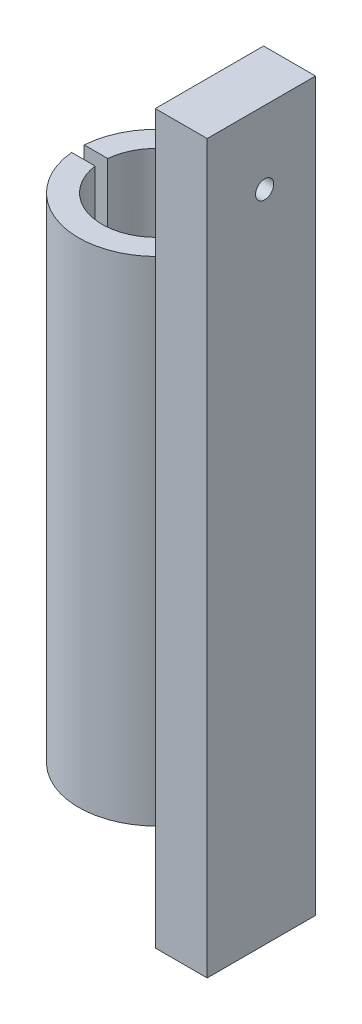
ISO-10303-21;
HEADER;
FILE_DESCRIPTION(('STEP AP214'),'2;1');
FILE_NAME('part.step','',(''),(''),'','','');
FILE_SCHEMA(('AUTOMOTIVE_DESIGN { 1 0 10303 214 1 1 1 1 }'));
ENDSEC;
DATA;
#1=APPLICATION_CONTEXT('core data for automotive mechanical design processes');
#2=APPLICATION_PROTOCOL_DEFINITION('international standard','automotive_design',2000,#1);
#3=PRODUCT_CONTEXT('',#1,'mechanical');
#4=PRODUCT('Part','Part','',(#3));
#5=PRODUCT_RELATED_PRODUCT_CATEGORY('part','',(#4));
#6=PRODUCT_DEFINITION_FORMATION('','',#4);
#7=PRODUCT_DEFINITION_CONTEXT('part definition',#1,'design');
#8=PRODUCT_DEFINITION('design','',#6,#7);
#9=PRODUCT_DEFINITION_SHAPE('','',#8);
#10=(LENGTH_UNIT() NAMED_UNIT(*) SI_UNIT(.MILLI.,.METRE.));
#11=(NAMED_UNIT(*) PLANE_ANGLE_UNIT() SI_UNIT($,.RADIAN.));
#12=(NAMED_UNIT(*) SI_UNIT($,.STERADIAN.) SOLID_ANGLE_UNIT());
#13=UNCERTAINTY_MEASURE_WITH_UNIT(LENGTH_MEASURE(1.E-05),#10,'distance_accuracy_value','');
#14=(GEOMETRIC_REPRESENTATION_CONTEXT(3) GLOBAL_UNCERTAINTY_ASSIGNED_CONTEXT((#13)) GLOBAL_UNIT_ASSIGNED_CONTEXT((#10,
#11,#12)) REPRESENTATION_CONTEXT('',''));
#15=CARTESIAN_POINT('',(0.,0.,0.));
#16=DIRECTION('',(0.,0.,1.));
#17=DIRECTION('',(1.,0.,0.));
#18=AXIS2_PLACEMENT_3D('',#15,#16,#17);
#19=CARTESIAN_POINT('',(0.,95.,0.));
#20=DIRECTION('',(0.,-1.,0.));
#21=DIRECTION('',(0.,0.,-1.));
#22=AXIS2_PLACEMENT_3D('',#19,#20,#21);
#23=CYLINDRICAL_SURFACE('',#22,15.);
#24=CARTESIAN_POINT('',(0.,0.,0.));
#25=DIRECTION('',(0.,1.,0.));
#26=DIRECTION('',(0.,0.,1.));
#27=AXIS2_PLACEMENT_3D('',#24,#25,#26);
#28=CIRCLE('',#27,15.);
#29=CARTESIAN_POINT('',(11.3568734785766,0.,-9.79905223945678));
#30=VERTEX_POINT('',#29);
#31=CARTESIAN_POINT('',(-14.9642919549713,0.,-1.03439174705795));
#32=VERTEX_POINT('',#31);
#33=EDGE_CURVE('E207',#30,#32,#28,.T.);
#34=ORIENTED_EDGE('',*,*,#33,.T.);
#35=DIRECTION('',(0.,-1.,0.));
#36=VECTOR('',#35,1.);
#37=CARTESIAN_POINT('',(-14.9642919549713,95.,-1.03439174705795));
#38=LINE('',#37,#36);
#39=CARTESIAN_POINT('',(-14.9642919549713,35.,-1.03439174705795));
#40=VERTEX_POINT('',#39);
#41=EDGE_CURVE('E393',#32,#40,#38,.F.);
#42=ORIENTED_EDGE('',*,*,#41,.T.);
#43=CARTESIAN_POINT('',(0.,35.,0.));
#44=DIRECTION('',(0.,-1.,0.));
#45=DIRECTION('',(0.,0.,-1.));
#46=AXIS2_PLACEMENT_3D('',#43,#44,#45);
#47=CIRCLE('',#46,15.);
#48=CARTESIAN_POINT('',(0.,35.,-15.));
#49=VERTEX_POINT('',#48);
#50=EDGE_CURVE('E264',#40,#49,#47,.T.);
#51=ORIENTED_EDGE('',*,*,#50,.T.);
#52=DIRECTION('',(0.,1.,0.));
#53=VECTOR('',#52,1.);
#54=CARTESIAN_POINT('',(0.,35.,-15.));
#55=LINE('',#54,#53);
#56=CARTESIAN_POINT('',(0.,75.,-15.));
#57=VERTEX_POINT('',#56);
#58=EDGE_CURVE('E418',#49,#57,#55,.T.);
#59=ORIENTED_EDGE('',*,*,#58,.T.);
#60=CARTESIAN_POINT('',(0.,75.,0.));
#61=DIRECTION('',(0.,1.,0.));
#62=DIRECTION('',(0.,0.,1.));
#63=AXIS2_PLACEMENT_3D('',#60,#61,#62);
#64=CIRCLE('',#63,15.);
#65=CARTESIAN_POINT('',(-14.9642919549713,75.,-1.03439174705795));
#66=VERTEX_POINT('',#65);
#67=EDGE_CURVE('E268',#57,#66,#64,.T.);
#68=ORIENTED_EDGE('',*,*,#67,.T.);
#69=CARTESIAN_POINT('',(-14.9642919549713,95.,-1.03439174705795));
#70=VERTEX_POINT('',#69);
#71=EDGE_CURVE('E57',#66,#70,#38,.F.);
#72=ORIENTED_EDGE('',*,*,#71,.T.);
#73=CARTESIAN_POINT('',(0.,95.,0.));
#74=DIRECTION('',(0.,1.,0.));
#75=DIRECTION('',(0.,0.,1.));
#76=AXIS2_PLACEMENT_3D('',#73,#74,#75);
#77=CIRCLE('',#76,15.);
#78=CARTESIAN_POINT('',(11.3568734785766,95.,-9.79905223945678));
#79=VERTEX_POINT('',#78);
#80=EDGE_CURVE('E206',#79,#70,#77,.T.);
#81=ORIENTED_EDGE('',*,*,#80,.F.);
#82=DIRECTION('',(0.,-1.,0.));
#83=VECTOR('',#82,1.);
#84=CARTESIAN_POINT('',(11.3568734785766,95.,-9.79905223945678));
#85=LINE('',#84,#83);
#86=EDGE_CURVE('E326',#79,#30,#85,.T.);
#87=ORIENTED_EDGE('',*,*,#86,.T.);
#88=EDGE_LOOP('',(#34,#42,#51,#59,#68,#72,#81,#87));
#89=FACE_BOUND('',#88,.T.);
#90=ADVANCED_FACE('F41',(#89),#23,.T.);
#91=CARTESIAN_POINT('',(-15.,75.,-15.));
#92=DIRECTION('',(0.,1.,0.));
#93=DIRECTION('',(0.,0.,1.));
#94=AXIS2_PLACEMENT_3D('',#91,#92,#93);
#95=PLANE('',#94);
#96=CARTESIAN_POINT('',(0.,75.,0.));
#97=DIRECTION('',(0.,1.,0.));
#98=DIRECTION('',(0.,0.,1.));
#99=AXIS2_PLACEMENT_3D('',#96,#97,#98);
#100=CIRCLE('',#99,10.5);
#101=CARTESIAN_POINT('',(-10.4489250027751,75.,-1.03439174705795));
#102=VERTEX_POINT('',#101);
#103=CARTESIAN_POINT('',(0.,75.,-10.5));
#104=VERTEX_POINT('',#103);
#105=EDGE_CURVE('E239',#102,#104,#100,.F.);
#106=ORIENTED_EDGE('',*,*,#105,.F.);
#107=DIRECTION('',(-1.,0.,0.));
#108=VECTOR('',#107,1.);
#109=CARTESIAN_POINT('',(-15.,75.,-1.03439174705795));
#110=LINE('',#109,#108);
#111=EDGE_CURVE('E398',#102,#66,#110,.T.);
#112=ORIENTED_EDGE('',*,*,#111,.T.);
#113=ORIENTED_EDGE('',*,*,#67,.F.);
#114=DIRECTION('',(0.,0.,1.));
#115=VECTOR('',#114,1.);
#116=CARTESIAN_POINT('',(0.,75.,-15.));
#117=LINE('',#116,#115);
#118=EDGE_CURVE('E270',#57,#104,#117,.T.);
#119=ORIENTED_EDGE('',*,*,#118,.T.);
#120=EDGE_LOOP('',(#106,#112,#113,#119));
#121=FACE_BOUND('',#120,.T.);
#122=ADVANCED_FACE('F454',(#121),#95,.F.);
#123=CARTESIAN_POINT('',(-15.,35.,-15.));
#124=DIRECTION('',(0.,-1.,0.));
#125=DIRECTION('',(0.,0.,-1.));
#126=AXIS2_PLACEMENT_3D('',#123,#124,#125);
#127=PLANE('',#126);
#128=ORIENTED_EDGE('',*,*,#50,.F.);
#129=DIRECTION('',(1.,0.,0.));
#130=VECTOR('',#129,1.);
#131=CARTESIAN_POINT('',(-15.,35.,-1.03439174705795));
#132=LINE('',#131,#130);
#133=CARTESIAN_POINT('',(-10.4489250027751,35.,-1.03439174705795));
#134=VERTEX_POINT('',#133);
#135=EDGE_CURVE('E11',#40,#134,#132,.T.);
#136=ORIENTED_EDGE('',*,*,#135,.T.);
#137=CARTESIAN_POINT('',(0.,35.,0.));
#138=DIRECTION('',(0.,-1.,0.));
#139=DIRECTION('',(0.,0.,-1.));
#140=AXIS2_PLACEMENT_3D('',#137,#138,#139);
#141=CIRCLE('',#140,10.5);
#142=CARTESIAN_POINT('',(0.,35.,-10.5));
#143=VERTEX_POINT('',#142);
#144=EDGE_CURVE('E227',#143,#134,#141,.F.);
#145=ORIENTED_EDGE('',*,*,#144,.F.);
#146=DIRECTION('',(0.,0.,1.));
#147=VECTOR('',#146,1.);
#148=CARTESIAN_POINT('',(0.,35.,-15.));
#149=LINE('',#148,#147);
#150=EDGE_CURVE('E272',#49,#143,#149,.T.);
#151=ORIENTED_EDGE('',*,*,#150,.F.);
#152=EDGE_LOOP('',(#128,#136,#145,#151));
#153=FACE_BOUND('',#152,.T.);
#154=ADVANCED_FACE('F414',(#153),#127,.F.);
#155=CARTESIAN_POINT('',(-14.9312235125397,95.,1.43476981379639));
#156=VERTEX_POINT('',#155);
#157=CARTESIAN_POINT('',(10.8084393786436,95.,10.4008479557287));
#158=VERTEX_POINT('',#157);
#159=EDGE_CURVE('E194',#156,#158,#77,.T.);
#160=ORIENTED_EDGE('',*,*,#159,.F.);
#161=DIRECTION('',(0.,-1.,0.));
#162=VECTOR('',#161,1.);
#163=CARTESIAN_POINT('',(-14.9312235125397,95.,1.43476981379639));
#164=LINE('',#163,#162);
#165=CARTESIAN_POINT('',(-14.9312235125397,75.,1.43476981379639));
#166=VERTEX_POINT('',#165);
#167=EDGE_CURVE('E177',#156,#166,#164,.T.);
#168=ORIENTED_EDGE('',*,*,#167,.T.);
#169=CARTESIAN_POINT('',(-10.1304452596063,75.,11.0622818099215));
#170=VERTEX_POINT('',#169);
#171=EDGE_CURVE('E263',#166,#170,#64,.T.);
#172=ORIENTED_EDGE('',*,*,#171,.T.);
#173=DIRECTION('',(0.,-1.,0.));
#174=VECTOR('',#173,1.);
#175=CARTESIAN_POINT('',(-10.1304452596063,95.,11.0622818099215));
#176=LINE('',#175,#174);
#177=CARTESIAN_POINT('',(-10.1304452596063,35.,11.0622818099215));
#178=VERTEX_POINT('',#177);
#179=EDGE_CURVE('E244',#178,#170,#176,.F.);
#180=ORIENTED_EDGE('',*,*,#179,.F.);
#181=CARTESIAN_POINT('',(-14.9312235125397,35.,1.43476981379639));
#182=VERTEX_POINT('',#181);
#183=EDGE_CURVE('E255',#178,#182,#47,.T.);
#184=ORIENTED_EDGE('',*,*,#183,.T.);
#185=CARTESIAN_POINT('',(-14.9312235125397,0.,1.43476981379639));
#186=VERTEX_POINT('',#185);
#187=EDGE_CURVE('E188',#182,#186,#164,.T.);
#188=ORIENTED_EDGE('',*,*,#187,.T.);
#189=CARTESIAN_POINT('',(10.8084393786436,0.,10.4008479557287));
#190=VERTEX_POINT('',#189);
#191=EDGE_CURVE('E214',#186,#190,#28,.T.);
#192=ORIENTED_EDGE('',*,*,#191,.T.);
#193=DIRECTION('',(0.,-1.,0.));
#194=VECTOR('',#193,1.);
#195=CARTESIAN_POINT('',(10.8084393786436,95.,10.4008479557287));
#196=LINE('',#195,#194);
#197=EDGE_CURVE('E204',#190,#158,#196,.F.);
#198=ORIENTED_EDGE('',*,*,#197,.T.);
#199=EDGE_LOOP('',(#160,#168,#172,#180,#184,#188,#192,#198));
#200=FACE_BOUND('',#199,.T.);
#201=ADVANCED_FACE('F43',(#200),#23,.T.);
#202=CARTESIAN_POINT('',(0.,95.,0.));
#203=DIRECTION('',(0.,1.,0.));
#204=DIRECTION('',(0.,0.,1.));
#205=AXIS2_PLACEMENT_3D('',#202,#203,#204);
#206=PLANE('',#205);
#207=DIRECTION('',(-1.,0.,0.));
#208=VECTOR('',#207,1.);
#209=CARTESIAN_POINT('',(-17.9321448671644,95.,-1.03439174705795));
#210=LINE('',#209,#208);
#211=CARTESIAN_POINT('',(-10.4489250027751,95.,-1.03439174705795));
#212=VERTEX_POINT('',#211);
#213=EDGE_CURVE('E199',#212,#70,#210,.T.);
#214=ORIENTED_EDGE('',*,*,#213,.F.);
#215=CARTESIAN_POINT('',(0.,95.,0.));
#216=DIRECTION('',(0.,1.,0.));
#217=DIRECTION('',(0.,0.,1.));
#218=AXIS2_PLACEMENT_3D('',#215,#216,#217);
#219=CIRCLE('',#218,10.5);
#220=CARTESIAN_POINT('',(-10.4015112162329,95.,1.43476981379639));
#221=VERTEX_POINT('',#220);
#222=EDGE_CURVE('E197',#221,#212,#219,.T.);
#223=ORIENTED_EDGE('',*,*,#222,.F.);
#224=DIRECTION('',(1.,0.,0.));
#225=VECTOR('',#224,1.);
#226=CARTESIAN_POINT('',(-17.9321448671644,95.,1.43476981379639));
#227=LINE('',#226,#225);
#228=EDGE_CURVE('E180',#156,#221,#227,.T.);
#229=ORIENTED_EDGE('',*,*,#228,.F.);
#230=ORIENTED_EDGE('',*,*,#159,.T.);
#231=DIRECTION('',(0.,0.,1.));
#232=VECTOR('',#231,1.);
#233=CARTESIAN_POINT('',(10.8084393786436,95.,0.));
#234=LINE('',#233,#232);
#235=CARTESIAN_POINT('',(10.8084393786436,95.,-9.79905223945678));
#236=VERTEX_POINT('',#235);
#237=EDGE_CURVE('E323',#236,#158,#234,.T.);
#238=ORIENTED_EDGE('',*,*,#237,.F.);
#239=DIRECTION('',(-1.,0.,0.));
#240=VECTOR('',#239,1.);
#241=CARTESIAN_POINT('',(0.,95.,-9.79905223945679));
#242=LINE('',#241,#240);
#243=EDGE_CURVE('E330',#79,#236,#242,.T.);
#244=ORIENTED_EDGE('',*,*,#243,.F.);
#245=ORIENTED_EDGE('',*,*,#80,.T.);
#246=EDGE_LOOP('',(#214,#223,#229,#230,#238,#244,#245));
#247=FACE_BOUND('',#246,.T.);
#248=ADVANCED_FACE('F192',(#247),#206,.T.);
#249=CARTESIAN_POINT('',(0.,0.,0.));
#250=DIRECTION('',(0.,1.,0.));
#251=DIRECTION('',(0.,0.,1.));
#252=AXIS2_PLACEMENT_3D('',#249,#250,#251);
#253=PLANE('',#252);
#254=CARTESIAN_POINT('',(0.,0.,0.));
#255=DIRECTION('',(0.,1.,0.));
#256=DIRECTION('',(0.,0.,1.));
#257=AXIS2_PLACEMENT_3D('',#254,#255,#256);
#258=CIRCLE('',#257,10.5);
#259=CARTESIAN_POINT('',(-10.4015112162329,0.,1.43476981379639));
#260=VERTEX_POINT('',#259);
#261=CARTESIAN_POINT('',(-10.4489250027751,0.,-1.03439174705795));
#262=VERTEX_POINT('',#261);
#263=EDGE_CURVE('E332',#260,#262,#258,.T.);
#264=ORIENTED_EDGE('',*,*,#263,.T.);
#265=DIRECTION('',(-1.,0.,0.));
#266=VECTOR('',#265,1.);
#267=CARTESIAN_POINT('',(0.,0.,-1.03439174705795));
#268=LINE('',#267,#266);
#269=EDGE_CURVE('E404',#262,#32,#268,.T.);
#270=ORIENTED_EDGE('',*,*,#269,.T.);
#271=ORIENTED_EDGE('',*,*,#33,.F.);
#272=DIRECTION('',(-1.,0.,0.));
#273=VECTOR('',#272,1.);
#274=CARTESIAN_POINT('',(0.,0.,-9.79905223945679));
#275=LINE('',#274,#273);
#276=CARTESIAN_POINT('',(10.8084393786436,0.,-9.79905223945678));
#277=VERTEX_POINT('',#276);
#278=EDGE_CURVE('E222',#30,#277,#275,.T.);
#279=ORIENTED_EDGE('',*,*,#278,.T.);
#280=DIRECTION('',(0.,0.,1.));
#281=VECTOR('',#280,1.);
#282=CARTESIAN_POINT('',(10.8084393786436,0.,0.));
#283=LINE('',#282,#281);
#284=EDGE_CURVE('E212',#277,#190,#283,.T.);
#285=ORIENTED_EDGE('',*,*,#284,.T.);
#286=ORIENTED_EDGE('',*,*,#191,.F.);
#287=DIRECTION('',(1.,0.,0.));
#288=VECTOR('',#287,1.);
#289=CARTESIAN_POINT('',(0.,0.,1.43476981379639));
#290=LINE('',#289,#288);
#291=EDGE_CURVE('E354',#186,#260,#290,.T.);
#292=ORIENTED_EDGE('',*,*,#291,.T.);
#293=EDGE_LOOP('',(#264,#270,#271,#279,#285,#286,#292));
#294=FACE_BOUND('',#293,.T.);
#295=ADVANCED_FACE('F471',(#294),#253,.F.);
#296=CARTESIAN_POINT('',(0.,0.,0.));
#297=DIRECTION('',(0.,1.,0.));
#298=DIRECTION('',(0.,0.,1.));
#299=AXIS2_PLACEMENT_3D('',#296,#297,#298);
#300=CYLINDRICAL_SURFACE('',#299,10.5);
#301=ORIENTED_EDGE('',*,*,#222,.T.);
#302=DIRECTION('',(0.,1.,0.));
#303=VECTOR('',#302,1.);
#304=CARTESIAN_POINT('',(-10.4489250027751,0.,-1.03439174705795));
#305=LINE('',#304,#303);
#306=EDGE_CURVE('E344',#212,#102,#305,.F.);
#307=ORIENTED_EDGE('',*,*,#306,.T.);
#308=ORIENTED_EDGE('',*,*,#105,.T.);
#309=DIRECTION('',(0.,1.,0.));
#310=VECTOR('',#309,1.);
#311=CARTESIAN_POINT('',(0.,0.,-10.5));
#312=LINE('',#311,#310);
#313=EDGE_CURVE('E235',#104,#143,#312,.F.);
#314=ORIENTED_EDGE('',*,*,#313,.T.);
#315=ORIENTED_EDGE('',*,*,#144,.T.);
#316=EDGE_CURVE('E186',#134,#262,#305,.F.);
#317=ORIENTED_EDGE('',*,*,#316,.T.);
#318=ORIENTED_EDGE('',*,*,#263,.F.);
#319=DIRECTION('',(0.,1.,0.));
#320=VECTOR('',#319,1.);
#321=CARTESIAN_POINT('',(-10.4015112162329,0.,1.43476981379639));
#322=LINE('',#321,#320);
#323=CARTESIAN_POINT('',(-10.4015112162329,35.,1.43476981379639));
#324=VERTEX_POINT('',#323);
#325=EDGE_CURVE('E348',#260,#324,#322,.T.);
#326=ORIENTED_EDGE('',*,*,#325,.T.);
#327=CARTESIAN_POINT('',(0.,35.,10.5));
#328=VERTEX_POINT('',#327);
#329=EDGE_CURVE('E226',#324,#328,#141,.F.);
#330=ORIENTED_EDGE('',*,*,#329,.T.);
#331=DIRECTION('',(0.,1.,0.));
#332=VECTOR('',#331,1.);
#333=CARTESIAN_POINT('',(0.,0.,10.5));
#334=LINE('',#333,#332);
#335=CARTESIAN_POINT('',(0.,75.,10.5));
#336=VERTEX_POINT('',#335);
#337=EDGE_CURVE('E231',#328,#336,#334,.T.);
#338=ORIENTED_EDGE('',*,*,#337,.T.);
#339=CARTESIAN_POINT('',(-10.4015112162329,75.,1.43476981379639));
#340=VERTEX_POINT('',#339);
#341=EDGE_CURVE('E240',#336,#340,#100,.F.);
#342=ORIENTED_EDGE('',*,*,#341,.T.);
#343=EDGE_CURVE('E65',#340,#221,#322,.T.);
#344=ORIENTED_EDGE('',*,*,#343,.T.);
#345=EDGE_LOOP('',(#301,#307,#308,#314,#315,#317,#318,#326,#330,#338,#342,#344));
#346=FACE_BOUND('',#345,.T.);
#347=ADVANCED_FACE('F343',(#346),#300,.F.);
#348=CARTESIAN_POINT('',(10.8084393786436,120.,-9.79905223945678));
#349=DIRECTION('',(0.,0.,-1.));
#350=DIRECTION('',(-1.,0.,0.));
#351=AXIS2_PLACEMENT_3D('',#348,#349,#350);
#352=PLANE('',#351);
#353=ORIENTED_EDGE('',*,*,#86,.F.);
#354=ORIENTED_EDGE('',*,*,#243,.T.);
#355=DIRECTION('',(0.,-1.,0.));
#356=VECTOR('',#355,1.);
#357=CARTESIAN_POINT('',(10.8084393786436,120.,-9.79905223945678));
#358=LINE('',#357,#356);
#359=CARTESIAN_POINT('',(10.8084393786436,120.,-9.79905223945678));
#360=VERTEX_POINT('',#359);
#361=EDGE_CURVE('E308',#360,#236,#358,.T.);
#362=ORIENTED_EDGE('',*,*,#361,.F.);
#363=DIRECTION('',(1.,0.,0.));
#364=VECTOR('',#363,1.);
#365=CARTESIAN_POINT('',(10.8084393786436,120.,-9.79905223945678));
#366=LINE('',#365,#364);
#367=CARTESIAN_POINT('',(20.8084393786436,120.,-9.79905223945678));
#368=VERTEX_POINT('',#367);
#369=EDGE_CURVE('E293',#360,#368,#366,.T.);
#370=ORIENTED_EDGE('',*,*,#369,.T.);
#371=DIRECTION('',(0.,-1.,0.));
#372=VECTOR('',#371,1.);
#373=CARTESIAN_POINT('',(20.8084393786436,120.,-9.79905223945678));
#374=LINE('',#373,#372);
#375=CARTESIAN_POINT('',(20.8084393786436,-20.,-9.79905223945678));
#376=VERTEX_POINT('',#375);
#377=EDGE_CURVE('E307',#368,#376,#374,.T.);
#378=ORIENTED_EDGE('',*,*,#377,.T.);
#379=DIRECTION('',(1.,0.,0.));
#380=VECTOR('',#379,1.);
#381=CARTESIAN_POINT('',(10.8084393786436,-20.,-9.79905223945678));
#382=LINE('',#381,#380);
#383=CARTESIAN_POINT('',(10.8084393786436,-20.,-9.79905223945678));
#384=VERTEX_POINT('',#383);
#385=EDGE_CURVE('E277',#384,#376,#382,.T.);
#386=ORIENTED_EDGE('',*,*,#385,.F.);
#387=EDGE_CURVE('E312',#277,#384,#358,.T.);
#388=ORIENTED_EDGE('',*,*,#387,.F.);
#389=ORIENTED_EDGE('',*,*,#278,.F.);
#390=EDGE_LOOP('',(#353,#354,#362,#370,#378,#386,#388,#389));
#391=FACE_BOUND('',#390,.T.);
#392=ADVANCED_FACE('F380',(#391),#352,.T.);
#393=CARTESIAN_POINT('',(10.8084393786436,120.,11.0622818099215));
#394=DIRECTION('',(-1.,0.,0.));
#395=DIRECTION('',(0.,0.,1.));
#396=AXIS2_PLACEMENT_3D('',#393,#394,#395);
#397=PLANE('',#396);
#398=CARTESIAN_POINT('',(10.8084393786436,106.,0.));
#399=DIRECTION('',(-1.,0.,0.));
#400=DIRECTION('',(0.,0.,1.));
#401=AXIS2_PLACEMENT_3D('',#398,#399,#400);
#402=CIRCLE('',#401,1.75);
#403=CARTESIAN_POINT('',(10.8084393786436,106.,1.75));
#404=VERTEX_POINT('',#403);
#405=EDGE_CURVE('E358',#404,#404,#402,.T.);
#406=ORIENTED_EDGE('',*,*,#405,.F.);
#407=EDGE_LOOP('',(#406));
#408=FACE_BOUND('',#407,.T.);
#409=ORIENTED_EDGE('',*,*,#361,.T.);
#410=ORIENTED_EDGE('',*,*,#237,.T.);
#411=ORIENTED_EDGE('',*,*,#197,.F.);
#412=ORIENTED_EDGE('',*,*,#284,.F.);
#413=ORIENTED_EDGE('',*,*,#387,.T.);
#414=DIRECTION('',(0.,0.,-1.));
#415=VECTOR('',#414,1.);
#416=CARTESIAN_POINT('',(10.8084393786436,-20.,11.0622818099215));
#417=LINE('',#416,#415);
#418=CARTESIAN_POINT('',(10.8084393786436,-20.,11.0622818099215));
#419=VERTEX_POINT('',#418);
#420=EDGE_CURVE('E289',#419,#384,#417,.T.);
#421=ORIENTED_EDGE('',*,*,#420,.F.);
#422=DIRECTION('',(0.,-1.,0.));
#423=VECTOR('',#422,1.);
#424=CARTESIAN_POINT('',(10.8084393786436,120.,11.0622818099215));
#425=LINE('',#424,#423);
#426=CARTESIAN_POINT('',(10.8084393786436,120.,11.0622818099215));
#427=VERTEX_POINT('',#426);
#428=EDGE_CURVE('E313',#427,#419,#425,.T.);
#429=ORIENTED_EDGE('',*,*,#428,.F.);
#430=DIRECTION('',(0.,0.,-1.));
#431=VECTOR('',#430,1.);
#432=CARTESIAN_POINT('',(10.8084393786436,120.,11.0622818099215));
#433=LINE('',#432,#431);
#434=EDGE_CURVE('E303',#427,#360,#433,.T.);
#435=ORIENTED_EDGE('',*,*,#434,.T.);
#436=EDGE_LOOP('',(#409,#410,#411,#412,#413,#421,#429,#435));
#437=FACE_BOUND('',#436,.T.);
#438=ADVANCED_FACE('F376',(#408,#437),#397,.T.);
#439=CARTESIAN_POINT('',(10.8084393786436,120.,11.0622818099215));
#440=DIRECTION('',(0.,0.,-1.));
#441=DIRECTION('',(-1.,0.,0.));
#442=AXIS2_PLACEMENT_3D('',#439,#440,#441);
#443=PLANE('',#442);
#444=ORIENTED_EDGE('',*,*,#428,.T.);
#445=DIRECTION('',(1.,0.,0.));
#446=VECTOR('',#445,1.);
#447=CARTESIAN_POINT('',(10.8084393786436,-20.,11.0622818099215));
#448=LINE('',#447,#446);
#449=CARTESIAN_POINT('',(20.8084393786436,-20.,11.0622818099215));
#450=VERTEX_POINT('',#449);
#451=EDGE_CURVE('E285',#419,#450,#448,.T.);
#452=ORIENTED_EDGE('',*,*,#451,.T.);
#453=DIRECTION('',(0.,-1.,0.));
#454=VECTOR('',#453,1.);
#455=CARTESIAN_POINT('',(20.8084393786436,120.,11.0622818099215));
#456=LINE('',#455,#454);
#457=CARTESIAN_POINT('',(20.8084393786436,120.,11.0622818099215));
#458=VERTEX_POINT('',#457);
#459=EDGE_CURVE('E316',#458,#450,#456,.T.);
#460=ORIENTED_EDGE('',*,*,#459,.F.);
#461=DIRECTION('',(1.,0.,0.));
#462=VECTOR('',#461,1.);
#463=CARTESIAN_POINT('',(10.8084393786436,120.,11.0622818099215));
#464=LINE('',#463,#462);
#465=EDGE_CURVE('E300',#427,#458,#464,.T.);
#466=ORIENTED_EDGE('',*,*,#465,.F.);
#467=EDGE_LOOP('',(#444,#452,#460,#466));
#468=FACE_BOUND('',#467,.T.);
#469=ADVANCED_FACE('F379',(#468),#443,.F.);
#470=CARTESIAN_POINT('',(20.8084393786436,120.,11.0622818099215));
#471=DIRECTION('',(-1.,0.,0.));
#472=DIRECTION('',(0.,0.,1.));
#473=AXIS2_PLACEMENT_3D('',#470,#471,#472);
#474=PLANE('',#473);
#475=CARTESIAN_POINT('',(20.8084393786436,106.,0.));
#476=DIRECTION('',(-1.,0.,0.));
#477=DIRECTION('',(0.,0.,1.));
#478=AXIS2_PLACEMENT_3D('',#475,#476,#477);
#479=CIRCLE('',#478,1.75);
#480=CARTESIAN_POINT('',(20.8084393786436,106.,1.75));
#481=VERTEX_POINT('',#480);
#482=EDGE_CURVE('E200',#481,#481,#479,.T.);
#483=ORIENTED_EDGE('',*,*,#482,.T.);
#484=EDGE_LOOP('',(#483));
#485=FACE_BOUND('',#484,.T.);
#486=ORIENTED_EDGE('',*,*,#459,.T.);
#487=DIRECTION('',(0.,0.,-1.));
#488=VECTOR('',#487,1.);
#489=CARTESIAN_POINT('',(20.8084393786436,-20.,11.0622818099215));
#490=LINE('',#489,#488);
#491=EDGE_CURVE('E281',#450,#376,#490,.T.);
#492=ORIENTED_EDGE('',*,*,#491,.T.);
#493=ORIENTED_EDGE('',*,*,#377,.F.);
#494=DIRECTION('',(0.,0.,-1.));
#495=VECTOR('',#494,1.);
#496=CARTESIAN_POINT('',(20.8084393786436,120.,11.0622818099215));
#497=LINE('',#496,#495);
#498=EDGE_CURVE('E297',#458,#368,#497,.T.);
#499=ORIENTED_EDGE('',*,*,#498,.F.);
#500=EDGE_LOOP('',(#486,#492,#493,#499));
#501=FACE_BOUND('',#500,.T.);
#502=ADVANCED_FACE('F366',(#485,#501),#474,.F.);
#503=CARTESIAN_POINT('',(0.,120.,0.));
#504=DIRECTION('',(0.,1.,0.));
#505=DIRECTION('',(0.,0.,1.));
#506=AXIS2_PLACEMENT_3D('',#503,#504,#505);
#507=PLANE('',#506);
#508=ORIENTED_EDGE('',*,*,#369,.F.);
#509=ORIENTED_EDGE('',*,*,#434,.F.);
#510=ORIENTED_EDGE('',*,*,#465,.T.);
#511=ORIENTED_EDGE('',*,*,#498,.T.);
#512=EDGE_LOOP('',(#508,#509,#510,#511));
#513=FACE_BOUND('',#512,.T.);
#514=ADVANCED_FACE('F507',(#513),#507,.T.);
#515=CARTESIAN_POINT('',(0.,-20.,0.));
#516=DIRECTION('',(0.,1.,0.));
#517=DIRECTION('',(0.,0.,1.));
#518=AXIS2_PLACEMENT_3D('',#515,#516,#517);
#519=PLANE('',#518);
#520=ORIENTED_EDGE('',*,*,#385,.T.);
#521=ORIENTED_EDGE('',*,*,#491,.F.);
#522=ORIENTED_EDGE('',*,*,#451,.F.);
#523=ORIENTED_EDGE('',*,*,#420,.T.);
#524=EDGE_LOOP('',(#520,#521,#522,#523));
#525=FACE_BOUND('',#524,.T.);
#526=ADVANCED_FACE('F460',(#525),#519,.F.);
#527=CARTESIAN_POINT('',(0.,0.,11.0622818099215));
#528=DIRECTION('',(0.,0.,-1.));
#529=DIRECTION('',(-1.,0.,0.));
#530=AXIS2_PLACEMENT_3D('',#527,#528,#529);
#531=PLANE('',#530);
#532=ORIENTED_EDGE('',*,*,#179,.T.);
#533=DIRECTION('',(-1.,0.,0.));
#534=VECTOR('',#533,1.);
#535=CARTESIAN_POINT('',(-15.,75.,11.0622818099215));
#536=LINE('',#535,#534);
#537=CARTESIAN_POINT('',(0.,75.,11.0622818099215));
#538=VERTEX_POINT('',#537);
#539=EDGE_CURVE('E423',#538,#170,#536,.T.);
#540=ORIENTED_EDGE('',*,*,#539,.F.);
#541=DIRECTION('',(0.,1.,0.));
#542=VECTOR('',#541,1.);
#543=CARTESIAN_POINT('',(0.,35.,11.0622818099215));
#544=LINE('',#543,#542);
#545=CARTESIAN_POINT('',(0.,35.,11.0622818099215));
#546=VERTEX_POINT('',#545);
#547=EDGE_CURVE('E396',#546,#538,#544,.T.);
#548=ORIENTED_EDGE('',*,*,#547,.F.);
#549=DIRECTION('',(1.,0.,0.));
#550=VECTOR('',#549,1.);
#551=CARTESIAN_POINT('',(-15.,35.,11.0622818099215));
#552=LINE('',#551,#550);
#553=EDGE_CURVE('E391',#178,#546,#552,.T.);
#554=ORIENTED_EDGE('',*,*,#553,.F.);
#555=EDGE_LOOP('',(#532,#540,#548,#554));
#556=FACE_BOUND('',#555,.T.);
#557=ADVANCED_FACE('F450',(#556),#531,.T.);
#558=ORIENTED_EDGE('',*,*,#171,.F.);
#559=DIRECTION('',(1.,0.,0.));
#560=VECTOR('',#559,1.);
#561=CARTESIAN_POINT('',(-15.,75.,1.43476981379639));
#562=LINE('',#561,#560);
#563=EDGE_CURVE('E181',#166,#340,#562,.T.);
#564=ORIENTED_EDGE('',*,*,#563,.T.);
#565=ORIENTED_EDGE('',*,*,#341,.F.);
#566=EDGE_CURVE('E434',#336,#538,#117,.T.);
#567=ORIENTED_EDGE('',*,*,#566,.T.);
#568=ORIENTED_EDGE('',*,*,#539,.T.);
#569=EDGE_LOOP('',(#558,#564,#565,#567,#568));
#570=FACE_BOUND('',#569,.T.);
#571=ADVANCED_FACE('F451',(#570),#95,.F.);
#572=CARTESIAN_POINT('',(0.,35.,-15.));
#573=DIRECTION('',(1.,0.,0.));
#574=DIRECTION('',(0.,0.,-1.));
#575=AXIS2_PLACEMENT_3D('',#572,#573,#574);
#576=PLANE('',#575);
#577=ORIENTED_EDGE('',*,*,#118,.F.);
#578=ORIENTED_EDGE('',*,*,#58,.F.);
#579=ORIENTED_EDGE('',*,*,#150,.T.);
#580=ORIENTED_EDGE('',*,*,#313,.F.);
#581=EDGE_LOOP('',(#577,#578,#579,#580));
#582=FACE_BOUND('',#581,.T.);
#583=ADVANCED_FACE('F441',(#582),#576,.F.);
#584=EDGE_CURVE('E422',#328,#546,#149,.T.);
#585=ORIENTED_EDGE('',*,*,#584,.T.);
#586=ORIENTED_EDGE('',*,*,#547,.T.);
#587=ORIENTED_EDGE('',*,*,#566,.F.);
#588=ORIENTED_EDGE('',*,*,#337,.F.);
#589=EDGE_LOOP('',(#585,#586,#587,#588));
#590=FACE_BOUND('',#589,.T.);
#591=ADVANCED_FACE('F447',(#590),#576,.F.);
#592=ORIENTED_EDGE('',*,*,#329,.F.);
#593=DIRECTION('',(-1.,0.,0.));
#594=VECTOR('',#593,1.);
#595=CARTESIAN_POINT('',(-15.,35.,1.43476981379639));
#596=LINE('',#595,#594);
#597=EDGE_CURVE('E50',#324,#182,#596,.T.);
#598=ORIENTED_EDGE('',*,*,#597,.T.);
#599=ORIENTED_EDGE('',*,*,#183,.F.);
#600=ORIENTED_EDGE('',*,*,#553,.T.);
#601=ORIENTED_EDGE('',*,*,#584,.F.);
#602=EDGE_LOOP('',(#592,#598,#599,#600,#601));
#603=FACE_BOUND('',#602,.T.);
#604=ADVANCED_FACE('F253',(#603),#127,.F.);
#605=CARTESIAN_POINT('',(-17.9321448671644,-20.,1.43476981379639));
#606=DIRECTION('',(0.,0.,1.));
#607=DIRECTION('',(1.,0.,0.));
#608=AXIS2_PLACEMENT_3D('',#605,#606,#607);
#609=PLANE('',#608);
#610=ORIENTED_EDGE('',*,*,#597,.F.);
#611=ORIENTED_EDGE('',*,*,#325,.F.);
#612=ORIENTED_EDGE('',*,*,#291,.F.);
#613=ORIENTED_EDGE('',*,*,#187,.F.);
#614=EDGE_LOOP('',(#610,#611,#612,#613));
#615=FACE_BOUND('',#614,.T.);
#616=ADVANCED_FACE('F478',(#615),#609,.F.);
#617=CARTESIAN_POINT('',(-17.9321448671644,-20.,-1.03439174705795));
#618=DIRECTION('',(0.,0.,-1.));
#619=DIRECTION('',(-1.,0.,0.));
#620=AXIS2_PLACEMENT_3D('',#617,#618,#619);
#621=PLANE('',#620);
#622=ORIENTED_EDGE('',*,*,#269,.F.);
#623=ORIENTED_EDGE('',*,*,#316,.F.);
#624=ORIENTED_EDGE('',*,*,#135,.F.);
#625=ORIENTED_EDGE('',*,*,#41,.F.);
#626=EDGE_LOOP('',(#622,#623,#624,#625));
#627=FACE_BOUND('',#626,.T.);
#628=ADVANCED_FACE('F412',(#627),#621,.F.);
#629=ORIENTED_EDGE('',*,*,#228,.T.);
#630=ORIENTED_EDGE('',*,*,#343,.F.);
#631=ORIENTED_EDGE('',*,*,#563,.F.);
#632=ORIENTED_EDGE('',*,*,#167,.F.);
#633=EDGE_LOOP('',(#629,#630,#631,#632));
#634=FACE_BOUND('',#633,.T.);
#635=ADVANCED_FACE('F179',(#634),#609,.F.);
#636=ORIENTED_EDGE('',*,*,#111,.F.);
#637=ORIENTED_EDGE('',*,*,#306,.F.);
#638=ORIENTED_EDGE('',*,*,#213,.T.);
#639=ORIENTED_EDGE('',*,*,#71,.F.);
#640=EDGE_LOOP('',(#636,#637,#638,#639));
#641=FACE_BOUND('',#640,.T.);
#642=ADVANCED_FACE('F372',(#641),#621,.F.);
#643=CARTESIAN_POINT('',(20.8084393786436,106.,0.));
#644=DIRECTION('',(-1.,0.,0.));
#645=DIRECTION('',(0.,0.,1.));
#646=AXIS2_PLACEMENT_3D('',#643,#644,#645);
#647=CYLINDRICAL_SURFACE('',#646,1.75);
#648=ORIENTED_EDGE('',*,*,#482,.F.);
#649=EDGE_LOOP('',(#648));
#650=FACE_BOUND('',#649,.T.);
#651=ORIENTED_EDGE('',*,*,#405,.T.);
#652=EDGE_LOOP('',(#651));
#653=FACE_BOUND('',#652,.T.);
#654=ADVANCED_FACE('F369',(#650,#653),#647,.F.);
#655=CLOSED_SHELL('',(#90,#122,#154,#201,#248,#295,#347,#392,#438,#469,#502,#514,#526,#557,#571,
#583,#591,#604,#616,#628,#635,#642,#654));
#656=MANIFOLD_SOLID_BREP('B2',#655);
#657=ADVANCED_BREP_SHAPE_REPRESENTATION('',(#18,#656),#14);
#658=SHAPE_DEFINITION_REPRESENTATION(#9,#657);
ENDSEC;
END-ISO-10303-21;
